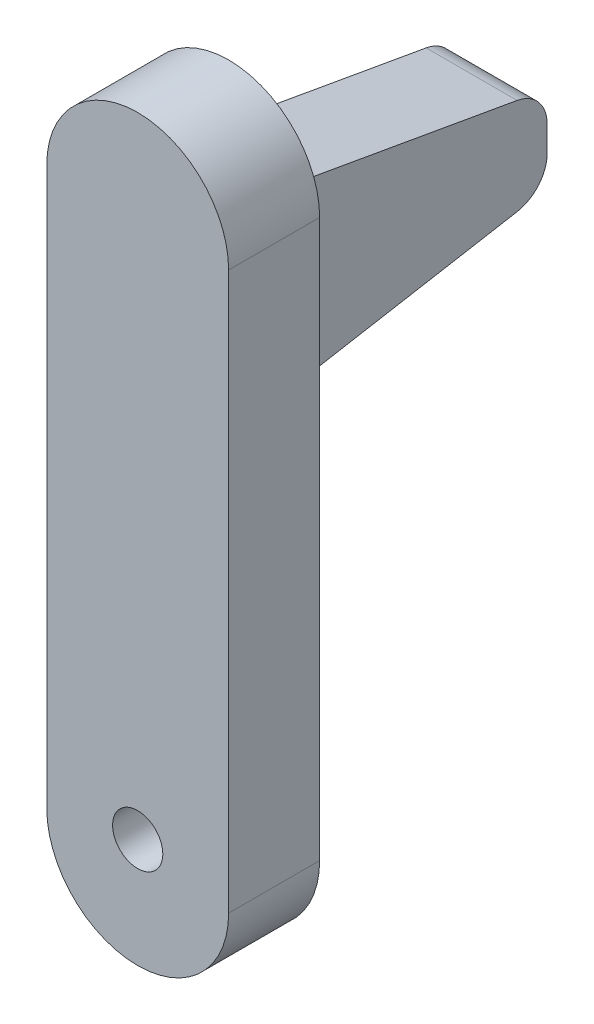
ISO-10303-21;
HEADER;
FILE_DESCRIPTION(('STEP AP214'),'2;1');
FILE_NAME('part.step','',(''),(''),'','','');
FILE_SCHEMA(('AUTOMOTIVE_DESIGN { 1 0 10303 214 1 1 1 1 }'));
ENDSEC;
DATA;
#1=APPLICATION_CONTEXT('core data for automotive mechanical design processes');
#2=APPLICATION_PROTOCOL_DEFINITION('international standard','automotive_design',2000,#1);
#3=PRODUCT_CONTEXT('',#1,'mechanical');
#4=PRODUCT('Part','Part','',(#3));
#5=PRODUCT_RELATED_PRODUCT_CATEGORY('part','',(#4));
#6=PRODUCT_DEFINITION_FORMATION('','',#4);
#7=PRODUCT_DEFINITION_CONTEXT('part definition',#1,'design');
#8=PRODUCT_DEFINITION('design','',#6,#7);
#9=PRODUCT_DEFINITION_SHAPE('','',#8);
#10=(LENGTH_UNIT() NAMED_UNIT(*) SI_UNIT(.MILLI.,.METRE.));
#11=(NAMED_UNIT(*) PLANE_ANGLE_UNIT() SI_UNIT($,.RADIAN.));
#12=(NAMED_UNIT(*) SI_UNIT($,.STERADIAN.) SOLID_ANGLE_UNIT());
#13=UNCERTAINTY_MEASURE_WITH_UNIT(LENGTH_MEASURE(1.E-05),#10,'distance_accuracy_value','');
#14=(GEOMETRIC_REPRESENTATION_CONTEXT(3) GLOBAL_UNCERTAINTY_ASSIGNED_CONTEXT((#13)) GLOBAL_UNIT_ASSIGNED_CONTEXT((#10,
#11,#12)) REPRESENTATION_CONTEXT('',''));
#15=CARTESIAN_POINT('',(0.,0.,0.));
#16=DIRECTION('',(0.,0.,1.));
#17=DIRECTION('',(1.,0.,0.));
#18=AXIS2_PLACEMENT_3D('',#15,#16,#17);
#19=CARTESIAN_POINT('',(0.,37.592,6.35));
#20=DIRECTION('',(0.,0.,1.));
#21=DIRECTION('',(1.,0.,0.));
#22=AXIS2_PLACEMENT_3D('',#19,#20,#21);
#23=PLANE('',#22);
#24=CARTESIAN_POINT('',(0.,37.592,6.35));
#25=DIRECTION('',(0.,0.,1.));
#26=DIRECTION('',(1.,0.,0.));
#27=AXIS2_PLACEMENT_3D('',#24,#25,#26);
#28=CIRCLE('',#27,6.34500691884959);
#29=CARTESIAN_POINT('',(6.34500691884959,37.592,6.35));
#30=VERTEX_POINT('',#29);
#31=CARTESIAN_POINT('',(-6.34500691884959,37.592,6.35));
#32=VERTEX_POINT('',#31);
#33=EDGE_CURVE('E194',#30,#32,#28,.T.);
#34=ORIENTED_EDGE('',*,*,#33,.T.);
#35=DIRECTION('',(0.,-1.,0.));
#36=VECTOR('',#35,1.);
#37=CARTESIAN_POINT('',(-6.34500691884959,-1.27,6.35));
#38=LINE('',#37,#36);
#39=CARTESIAN_POINT('',(-6.34500691884959,-1.27,6.35));
#40=VERTEX_POINT('',#39);
#41=EDGE_CURVE('E95',#32,#40,#38,.T.);
#42=ORIENTED_EDGE('',*,*,#41,.T.);
#43=CARTESIAN_POINT('',(0.,-1.27,6.35));
#44=DIRECTION('',(0.,0.,1.));
#45=DIRECTION('',(-1.,0.,0.));
#46=AXIS2_PLACEMENT_3D('',#43,#44,#45);
#47=CIRCLE('',#46,6.34500691884959);
#48=CARTESIAN_POINT('',(6.34500691884959,-1.27,6.35));
#49=VERTEX_POINT('',#48);
#50=EDGE_CURVE('E197',#40,#49,#47,.T.);
#51=ORIENTED_EDGE('',*,*,#50,.T.);
#52=DIRECTION('',(0.,1.,0.));
#53=VECTOR('',#52,1.);
#54=CARTESIAN_POINT('',(6.34500691884959,37.592,6.35));
#55=LINE('',#54,#53);
#56=EDGE_CURVE('E67',#49,#30,#55,.T.);
#57=ORIENTED_EDGE('',*,*,#56,.T.);
#58=EDGE_LOOP('',(#34,#42,#51,#57));
#59=FACE_BOUND('',#58,.T.);
#60=CARTESIAN_POINT('',(0.,0.,6.35));
#61=DIRECTION('',(0.,0.,1.));
#62=DIRECTION('',(1.,0.,0.));
#63=AXIS2_PLACEMENT_3D('',#60,#61,#62);
#64=CIRCLE('',#63,1.7526);
#65=CARTESIAN_POINT('',(1.7526,0.,6.35));
#66=VERTEX_POINT('',#65);
#67=EDGE_CURVE('E188',#66,#66,#64,.T.);
#68=ORIENTED_EDGE('',*,*,#67,.F.);
#69=EDGE_LOOP('',(#68));
#70=FACE_BOUND('',#69,.T.);
#71=ADVANCED_FACE('F43',(#59,#70),#23,.T.);
#72=CARTESIAN_POINT('',(0.,37.592,0.));
#73=DIRECTION('',(0.,0.,1.));
#74=DIRECTION('',(1.,0.,0.));
#75=AXIS2_PLACEMENT_3D('',#72,#73,#74);
#76=PLANE('',#75);
#77=DIRECTION('',(0.,-1.,0.));
#78=VECTOR('',#77,1.);
#79=CARTESIAN_POINT('',(-3.175,37.592,0.));
#80=LINE('',#79,#78);
#81=CARTESIAN_POINT('',(-3.175,37.592,0.));
#82=VERTEX_POINT('',#81);
#83=CARTESIAN_POINT('',(-3.175,24.892,0.));
#84=VERTEX_POINT('',#83);
#85=EDGE_CURVE('E167',#82,#84,#80,.T.);
#86=ORIENTED_EDGE('',*,*,#85,.T.);
#87=DIRECTION('',(1.,0.,0.));
#88=VECTOR('',#87,1.);
#89=CARTESIAN_POINT('',(-3.175,24.892,0.));
#90=LINE('',#89,#88);
#91=CARTESIAN_POINT('',(3.175,24.892,0.));
#92=VERTEX_POINT('',#91);
#93=EDGE_CURVE('E140',#84,#92,#90,.T.);
#94=ORIENTED_EDGE('',*,*,#93,.T.);
#95=DIRECTION('',(0.,-1.,0.));
#96=VECTOR('',#95,1.);
#97=CARTESIAN_POINT('',(3.175,37.592,0.));
#98=LINE('',#97,#96);
#99=CARTESIAN_POINT('',(3.175,37.592,0.));
#100=VERTEX_POINT('',#99);
#101=EDGE_CURVE('E147',#100,#92,#98,.T.);
#102=ORIENTED_EDGE('',*,*,#101,.F.);
#103=DIRECTION('',(1.,0.,0.));
#104=VECTOR('',#103,1.);
#105=CARTESIAN_POINT('',(-3.175,37.592,0.));
#106=LINE('',#105,#104);
#107=EDGE_CURVE('E131',#82,#100,#106,.T.);
#108=ORIENTED_EDGE('',*,*,#107,.F.);
#109=EDGE_LOOP('',(#86,#94,#102,#108));
#110=FACE_BOUND('',#109,.T.);
#111=CARTESIAN_POINT('',(0.,37.592,0.));
#112=DIRECTION('',(0.,0.,1.));
#113=DIRECTION('',(1.,0.,0.));
#114=AXIS2_PLACEMENT_3D('',#111,#112,#113);
#115=CIRCLE('',#114,6.34500691884959);
#116=CARTESIAN_POINT('',(6.34500691884959,37.592,0.));
#117=VERTEX_POINT('',#116);
#118=CARTESIAN_POINT('',(-6.34500691884959,37.592,0.));
#119=VERTEX_POINT('',#118);
#120=EDGE_CURVE('E191',#117,#119,#115,.T.);
#121=ORIENTED_EDGE('',*,*,#120,.F.);
#122=DIRECTION('',(0.,1.,0.));
#123=VECTOR('',#122,1.);
#124=CARTESIAN_POINT('',(6.34500691884959,37.592,0.));
#125=LINE('',#124,#123);
#126=CARTESIAN_POINT('',(6.34500691884959,-1.27,0.));
#127=VERTEX_POINT('',#126);
#128=EDGE_CURVE('E88',#127,#117,#125,.T.);
#129=ORIENTED_EDGE('',*,*,#128,.F.);
#130=CARTESIAN_POINT('',(0.,-1.27,0.));
#131=DIRECTION('',(0.,0.,1.));
#132=DIRECTION('',(-1.,0.,0.));
#133=AXIS2_PLACEMENT_3D('',#130,#131,#132);
#134=CIRCLE('',#133,6.34500691884959);
#135=CARTESIAN_POINT('',(-6.34500691884959,-1.27,0.));
#136=VERTEX_POINT('',#135);
#137=EDGE_CURVE('E205',#136,#127,#134,.T.);
#138=ORIENTED_EDGE('',*,*,#137,.F.);
#139=DIRECTION('',(0.,-1.,0.));
#140=VECTOR('',#139,1.);
#141=CARTESIAN_POINT('',(-6.34500691884959,-1.27,0.));
#142=LINE('',#141,#140);
#143=EDGE_CURVE('E203',#119,#136,#142,.T.);
#144=ORIENTED_EDGE('',*,*,#143,.F.);
#145=EDGE_LOOP('',(#121,#129,#138,#144));
#146=FACE_BOUND('',#145,.T.);
#147=CARTESIAN_POINT('',(0.,0.,0.));
#148=DIRECTION('',(0.,0.,1.));
#149=DIRECTION('',(1.,0.,0.));
#150=AXIS2_PLACEMENT_3D('',#147,#148,#149);
#151=CIRCLE('',#150,1.7526);
#152=CARTESIAN_POINT('',(1.7526,0.,0.));
#153=VERTEX_POINT('',#152);
#154=EDGE_CURVE('E180',#153,#153,#151,.T.);
#155=ORIENTED_EDGE('',*,*,#154,.T.);
#156=EDGE_LOOP('',(#155));
#157=FACE_BOUND('',#156,.T.);
#158=ADVANCED_FACE('F154',(#110,#146,#157),#76,.F.);
#159=CARTESIAN_POINT('',(0.,37.592,6.35));
#160=DIRECTION('',(0.,0.,-1.));
#161=DIRECTION('',(-1.,0.,0.));
#162=AXIS2_PLACEMENT_3D('',#159,#160,#161);
#163=CYLINDRICAL_SURFACE('',#162,6.34500691884959);
#164=ORIENTED_EDGE('',*,*,#120,.T.);
#165=DIRECTION('',(0.,0.,-1.));
#166=VECTOR('',#165,1.);
#167=CARTESIAN_POINT('',(-6.34500691884959,37.592,6.35));
#168=LINE('',#167,#166);
#169=EDGE_CURVE('E11',#32,#119,#168,.T.);
#170=ORIENTED_EDGE('',*,*,#169,.F.);
#171=ORIENTED_EDGE('',*,*,#33,.F.);
#172=DIRECTION('',(0.,0.,-1.));
#173=VECTOR('',#172,1.);
#174=CARTESIAN_POINT('',(6.34500691884959,37.592,6.35));
#175=LINE('',#174,#173);
#176=EDGE_CURVE('E200',#30,#117,#175,.T.);
#177=ORIENTED_EDGE('',*,*,#176,.T.);
#178=EDGE_LOOP('',(#164,#170,#171,#177));
#179=FACE_BOUND('',#178,.T.);
#180=ADVANCED_FACE('F45',(#179),#163,.T.);
#181=CARTESIAN_POINT('',(-6.34500691884959,-1.27,6.35));
#182=DIRECTION('',(1.,0.,0.));
#183=DIRECTION('',(0.,0.,-1.));
#184=AXIS2_PLACEMENT_3D('',#181,#182,#183);
#185=PLANE('',#184);
#186=ORIENTED_EDGE('',*,*,#143,.T.);
#187=DIRECTION('',(0.,0.,-1.));
#188=VECTOR('',#187,1.);
#189=CARTESIAN_POINT('',(-6.34500691884959,-1.27,6.35));
#190=LINE('',#189,#188);
#191=EDGE_CURVE('E51',#40,#136,#190,.T.);
#192=ORIENTED_EDGE('',*,*,#191,.F.);
#193=ORIENTED_EDGE('',*,*,#41,.F.);
#194=ORIENTED_EDGE('',*,*,#169,.T.);
#195=EDGE_LOOP('',(#186,#192,#193,#194));
#196=FACE_BOUND('',#195,.T.);
#197=ADVANCED_FACE('F231',(#196),#185,.F.);
#198=CARTESIAN_POINT('',(0.,-1.27,6.35));
#199=DIRECTION('',(0.,0.,-1.));
#200=DIRECTION('',(-1.,0.,0.));
#201=AXIS2_PLACEMENT_3D('',#198,#199,#200);
#202=CYLINDRICAL_SURFACE('',#201,6.34500691884959);
#203=ORIENTED_EDGE('',*,*,#137,.T.);
#204=DIRECTION('',(0.,0.,-1.));
#205=VECTOR('',#204,1.);
#206=CARTESIAN_POINT('',(6.34500691884959,-1.27,6.35));
#207=LINE('',#206,#205);
#208=EDGE_CURVE('E209',#49,#127,#207,.T.);
#209=ORIENTED_EDGE('',*,*,#208,.F.);
#210=ORIENTED_EDGE('',*,*,#50,.F.);
#211=ORIENTED_EDGE('',*,*,#191,.T.);
#212=EDGE_LOOP('',(#203,#209,#210,#211));
#213=FACE_BOUND('',#212,.T.);
#214=ADVANCED_FACE('F214',(#213),#202,.T.);
#215=CARTESIAN_POINT('',(6.34500691884959,37.592,6.35));
#216=DIRECTION('',(-1.,0.,0.));
#217=DIRECTION('',(0.,0.,1.));
#218=AXIS2_PLACEMENT_3D('',#215,#216,#217);
#219=PLANE('',#218);
#220=ORIENTED_EDGE('',*,*,#128,.T.);
#221=ORIENTED_EDGE('',*,*,#176,.F.);
#222=ORIENTED_EDGE('',*,*,#56,.F.);
#223=ORIENTED_EDGE('',*,*,#208,.T.);
#224=EDGE_LOOP('',(#220,#221,#222,#223));
#225=FACE_BOUND('',#224,.T.);
#226=ADVANCED_FACE('F221',(#225),#219,.F.);
#227=CARTESIAN_POINT('',(0.,0.,6.35));
#228=DIRECTION('',(0.,0.,-1.));
#229=DIRECTION('',(-1.,0.,0.));
#230=AXIS2_PLACEMENT_3D('',#227,#228,#229);
#231=CYLINDRICAL_SURFACE('',#230,1.7526);
#232=ORIENTED_EDGE('',*,*,#67,.T.);
#233=EDGE_LOOP('',(#232));
#234=FACE_BOUND('',#233,.T.);
#235=ORIENTED_EDGE('',*,*,#154,.F.);
#236=EDGE_LOOP('',(#235));
#237=FACE_BOUND('',#236,.T.);
#238=ADVANCED_FACE('F223',(#234,#237),#231,.F.);
#239=CARTESIAN_POINT('',(-3.175,34.6030696469645,-16.951066371274));
#240=DIRECTION('',(0.,0.984807753012209,-0.173648177666927));
#241=DIRECTION('',(0.,0.173648177666927,0.984807753012209));
#242=AXIS2_PLACEMENT_3D('',#239,#240,#241);
#243=PLANE('',#242);
#244=ORIENTED_EDGE('',*,*,#107,.T.);
#245=DIRECTION('',(0.,0.173648177666927,0.984807753012209));
#246=VECTOR('',#245,1.);
#247=CARTESIAN_POINT('',(3.175,34.6030696469645,-16.951066371274));
#248=LINE('',#247,#246);
#249=CARTESIAN_POINT('',(3.175,34.6030696469645,-16.951066371274));
#250=VERTEX_POINT('',#249);
#251=EDGE_CURVE('E134',#250,#100,#248,.T.);
#252=ORIENTED_EDGE('',*,*,#251,.F.);
#253=DIRECTION('',(1.,0.,0.));
#254=VECTOR('',#253,1.);
#255=CARTESIAN_POINT('',(-3.175,34.6030696469645,-16.951066371274));
#256=LINE('',#255,#254);
#257=CARTESIAN_POINT('',(-3.175,34.6030696469645,-16.951066371274));
#258=VERTEX_POINT('',#257);
#259=EDGE_CURVE('E178',#258,#250,#256,.T.);
#260=ORIENTED_EDGE('',*,*,#259,.F.);
#261=DIRECTION('',(0.,0.173648177666927,0.984807753012209));
#262=VECTOR('',#261,1.);
#263=CARTESIAN_POINT('',(-3.175,34.6030696469645,-16.951066371274));
#264=LINE('',#263,#262);
#265=EDGE_CURVE('E136',#258,#82,#264,.T.);
#266=ORIENTED_EDGE('',*,*,#265,.T.);
#267=EDGE_LOOP('',(#244,#252,#260,#266));
#268=FACE_BOUND('',#267,.T.);
#269=ADVANCED_FACE('F133',(#268),#243,.T.);
#270=CARTESIAN_POINT('',(-3.175,32.1016579543135,-16.51));
#271=DIRECTION('',(1.,0.,0.));
#272=DIRECTION('',(0.,0.,-1.));
#273=AXIS2_PLACEMENT_3D('',#270,#271,#272);
#274=CYLINDRICAL_SURFACE('',#273,2.54);
#275=ORIENTED_EDGE('',*,*,#259,.T.);
#276=CARTESIAN_POINT('',(3.175,32.1016579543135,-16.51));
#277=DIRECTION('',(1.,0.,0.));
#278=DIRECTION('',(0.,0.,-1.));
#279=AXIS2_PLACEMENT_3D('',#276,#277,#278);
#280=CIRCLE('',#279,2.54);
#281=CARTESIAN_POINT('',(3.175,32.1016579543135,-19.05));
#282=VERTEX_POINT('',#281);
#283=EDGE_CURVE('E151',#282,#250,#280,.T.);
#284=ORIENTED_EDGE('',*,*,#283,.F.);
#285=DIRECTION('',(1.,0.,0.));
#286=VECTOR('',#285,1.);
#287=CARTESIAN_POINT('',(-3.175,32.1016579543135,-19.05));
#288=LINE('',#287,#286);
#289=CARTESIAN_POINT('',(-3.175,32.1016579543135,-19.05));
#290=VERTEX_POINT('',#289);
#291=EDGE_CURVE('E181',#290,#282,#288,.T.);
#292=ORIENTED_EDGE('',*,*,#291,.F.);
#293=CARTESIAN_POINT('',(-3.175,32.1016579543135,-16.51));
#294=DIRECTION('',(1.,0.,0.));
#295=DIRECTION('',(0.,0.,-1.));
#296=AXIS2_PLACEMENT_3D('',#293,#294,#295);
#297=CIRCLE('',#296,2.54);
#298=EDGE_CURVE('E141',#290,#258,#297,.T.);
#299=ORIENTED_EDGE('',*,*,#298,.T.);
#300=EDGE_LOOP('',(#275,#284,#292,#299));
#301=FACE_BOUND('',#300,.T.);
#302=ADVANCED_FACE('F244',(#301),#274,.T.);
#303=CARTESIAN_POINT('',(-3.175,30.3823420456866,-19.05));
#304=DIRECTION('',(0.,0.,-1.));
#305=DIRECTION('',(-1.,0.,0.));
#306=AXIS2_PLACEMENT_3D('',#303,#304,#305);
#307=PLANE('',#306);
#308=ORIENTED_EDGE('',*,*,#291,.T.);
#309=DIRECTION('',(0.,1.,0.));
#310=VECTOR('',#309,1.);
#311=CARTESIAN_POINT('',(3.175,30.3823420456866,-19.05));
#312=LINE('',#311,#310);
#313=CARTESIAN_POINT('',(3.175,30.3823420456866,-19.05));
#314=VERTEX_POINT('',#313);
#315=EDGE_CURVE('E163',#314,#282,#312,.T.);
#316=ORIENTED_EDGE('',*,*,#315,.F.);
#317=DIRECTION('',(1.,0.,0.));
#318=VECTOR('',#317,1.);
#319=CARTESIAN_POINT('',(-3.175,30.3823420456866,-19.05));
#320=LINE('',#319,#318);
#321=CARTESIAN_POINT('',(-3.175,30.3823420456866,-19.05));
#322=VERTEX_POINT('',#321);
#323=EDGE_CURVE('E183',#322,#314,#320,.T.);
#324=ORIENTED_EDGE('',*,*,#323,.F.);
#325=DIRECTION('',(0.,1.,0.));
#326=VECTOR('',#325,1.);
#327=CARTESIAN_POINT('',(-3.175,30.3823420456866,-19.05));
#328=LINE('',#327,#326);
#329=EDGE_CURVE('E173',#322,#290,#328,.T.);
#330=ORIENTED_EDGE('',*,*,#329,.T.);
#331=EDGE_LOOP('',(#308,#316,#324,#330));
#332=FACE_BOUND('',#331,.T.);
#333=ADVANCED_FACE('F253',(#332),#307,.T.);
#334=CARTESIAN_POINT('',(-3.175,30.3823420456866,-16.51));
#335=DIRECTION('',(1.,0.,0.));
#336=DIRECTION('',(0.,0.,-1.));
#337=AXIS2_PLACEMENT_3D('',#334,#335,#336);
#338=CYLINDRICAL_SURFACE('',#337,2.54);
#339=ORIENTED_EDGE('',*,*,#323,.T.);
#340=CARTESIAN_POINT('',(3.175,30.3823420456866,-16.51));
#341=DIRECTION('',(1.,0.,0.));
#342=DIRECTION('',(0.,0.,-1.));
#343=AXIS2_PLACEMENT_3D('',#340,#341,#342);
#344=CIRCLE('',#343,2.54);
#345=CARTESIAN_POINT('',(3.175,27.8809303530356,-16.951066371274));
#346=VERTEX_POINT('',#345);
#347=EDGE_CURVE('E158',#346,#314,#344,.T.);
#348=ORIENTED_EDGE('',*,*,#347,.F.);
#349=DIRECTION('',(1.,0.,0.));
#350=VECTOR('',#349,1.);
#351=CARTESIAN_POINT('',(-3.175,27.8809303530356,-16.951066371274));
#352=LINE('',#351,#350);
#353=CARTESIAN_POINT('',(-3.175,27.8809303530356,-16.951066371274));
#354=VERTEX_POINT('',#353);
#355=EDGE_CURVE('E185',#354,#346,#352,.T.);
#356=ORIENTED_EDGE('',*,*,#355,.F.);
#357=CARTESIAN_POINT('',(-3.175,30.3823420456866,-16.51));
#358=DIRECTION('',(1.,0.,0.));
#359=DIRECTION('',(0.,0.,-1.));
#360=AXIS2_PLACEMENT_3D('',#357,#358,#359);
#361=CIRCLE('',#360,2.54);
#362=EDGE_CURVE('E170',#354,#322,#361,.T.);
#363=ORIENTED_EDGE('',*,*,#362,.T.);
#364=EDGE_LOOP('',(#339,#348,#356,#363));
#365=FACE_BOUND('',#364,.T.);
#366=ADVANCED_FACE('F249',(#365),#338,.T.);
#367=CARTESIAN_POINT('',(-3.175,27.8809303530356,-16.951066371274));
#368=DIRECTION('',(0.,-0.984807753012207,-0.173648177666935));
#369=DIRECTION('',(0.,0.173648177666935,-0.984807753012207));
#370=AXIS2_PLACEMENT_3D('',#367,#368,#369);
#371=PLANE('',#370);
#372=ORIENTED_EDGE('',*,*,#355,.T.);
#373=DIRECTION('',(0.,0.173648177666935,-0.984807753012207));
#374=VECTOR('',#373,1.);
#375=CARTESIAN_POINT('',(3.175,27.8809303530356,-16.951066371274));
#376=LINE('',#375,#374);
#377=EDGE_CURVE('E156',#92,#346,#376,.T.);
#378=ORIENTED_EDGE('',*,*,#377,.F.);
#379=ORIENTED_EDGE('',*,*,#93,.F.);
#380=DIRECTION('',(0.,0.173648177666935,-0.984807753012207));
#381=VECTOR('',#380,1.);
#382=CARTESIAN_POINT('',(-3.175,27.8809303530356,-16.951066371274));
#383=LINE('',#382,#381);
#384=EDGE_CURVE('E58',#84,#354,#383,.T.);
#385=ORIENTED_EDGE('',*,*,#384,.T.);
#386=EDGE_LOOP('',(#372,#378,#379,#385));
#387=FACE_BOUND('',#386,.T.);
#388=ADVANCED_FACE('F245',(#387),#371,.T.);
#389=CARTESIAN_POINT('',(-3.175,30.3823420456866,-16.51));
#390=DIRECTION('',(1.,0.,0.));
#391=DIRECTION('',(0.,0.,-1.));
#392=AXIS2_PLACEMENT_3D('',#389,#390,#391);
#393=PLANE('',#392);
#394=ORIENTED_EDGE('',*,*,#265,.F.);
#395=ORIENTED_EDGE('',*,*,#298,.F.);
#396=ORIENTED_EDGE('',*,*,#329,.F.);
#397=ORIENTED_EDGE('',*,*,#362,.F.);
#398=ORIENTED_EDGE('',*,*,#384,.F.);
#399=ORIENTED_EDGE('',*,*,#85,.F.);
#400=EDGE_LOOP('',(#394,#395,#396,#397,#398,#399));
#401=FACE_BOUND('',#400,.T.);
#402=ADVANCED_FACE('F248',(#401),#393,.F.);
#403=CARTESIAN_POINT('',(3.175,30.3823420456866,-16.51));
#404=DIRECTION('',(1.,0.,0.));
#405=DIRECTION('',(0.,0.,-1.));
#406=AXIS2_PLACEMENT_3D('',#403,#404,#405);
#407=PLANE('',#406);
#408=ORIENTED_EDGE('',*,*,#251,.T.);
#409=ORIENTED_EDGE('',*,*,#101,.T.);
#410=ORIENTED_EDGE('',*,*,#377,.T.);
#411=ORIENTED_EDGE('',*,*,#347,.T.);
#412=ORIENTED_EDGE('',*,*,#315,.T.);
#413=ORIENTED_EDGE('',*,*,#283,.T.);
#414=EDGE_LOOP('',(#408,#409,#410,#411,#412,#413));
#415=FACE_BOUND('',#414,.T.);
#416=ADVANCED_FACE('F145',(#415),#407,.T.);
#417=CLOSED_SHELL('',(#71,#158,#180,#197,#214,#226,#238,#269,#302,#333,#366,#388,#402,#416));
#418=MANIFOLD_SOLID_BREP('B2',#417);
#419=ADVANCED_BREP_SHAPE_REPRESENTATION('',(#18,#418),#14);
#420=SHAPE_DEFINITION_REPRESENTATION(#9,#419);
ENDSEC;
END-ISO-10303-21;
